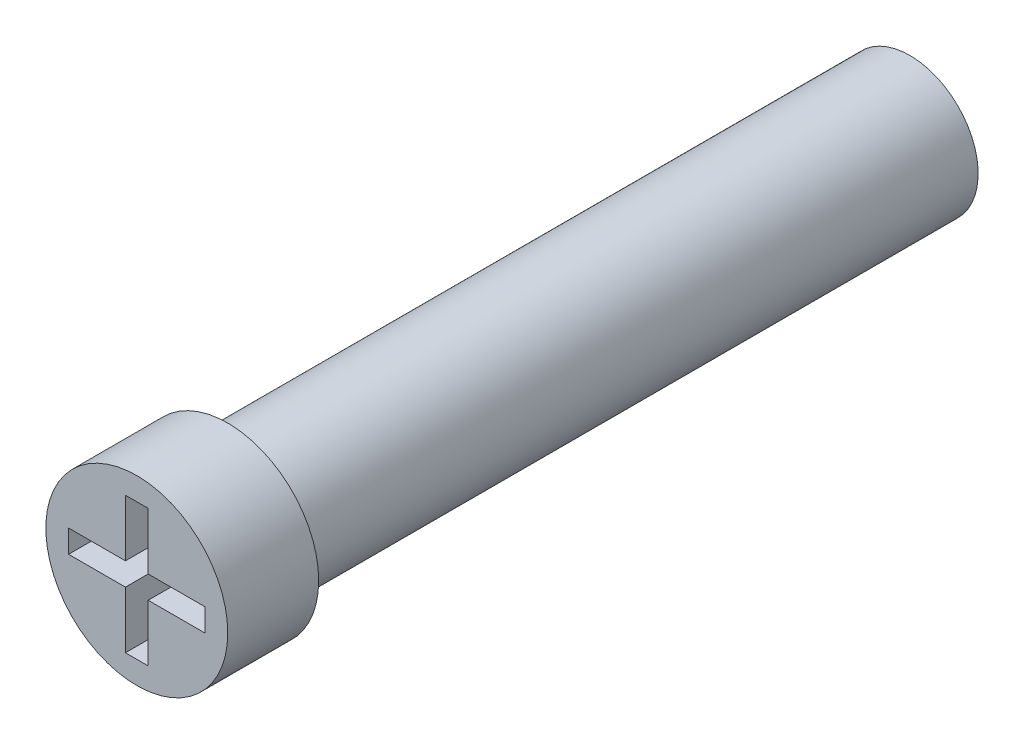
ISO-10303-21;
HEADER;
FILE_DESCRIPTION(('STEP AP214'),'2;1');
FILE_NAME('part.step','',(''),(''),'','','');
FILE_SCHEMA(('AUTOMOTIVE_DESIGN { 1 0 10303 214 1 1 1 1 }'));
ENDSEC;
DATA;
#1=APPLICATION_CONTEXT('core data for automotive mechanical design processes');
#2=APPLICATION_PROTOCOL_DEFINITION('international standard','automotive_design',2000,#1);
#3=PRODUCT_CONTEXT('',#1,'mechanical');
#4=PRODUCT('Part','Part','',(#3));
#5=PRODUCT_RELATED_PRODUCT_CATEGORY('part','',(#4));
#6=PRODUCT_DEFINITION_FORMATION('','',#4);
#7=PRODUCT_DEFINITION_CONTEXT('part definition',#1,'design');
#8=PRODUCT_DEFINITION('design','',#6,#7);
#9=PRODUCT_DEFINITION_SHAPE('','',#8);
#10=(LENGTH_UNIT() NAMED_UNIT(*) SI_UNIT(.MILLI.,.METRE.));
#11=(NAMED_UNIT(*) PLANE_ANGLE_UNIT() SI_UNIT($,.RADIAN.));
#12=(NAMED_UNIT(*) SI_UNIT($,.STERADIAN.) SOLID_ANGLE_UNIT());
#13=UNCERTAINTY_MEASURE_WITH_UNIT(LENGTH_MEASURE(1.E-05),#10,'distance_accuracy_value','');
#14=(GEOMETRIC_REPRESENTATION_CONTEXT(3) GLOBAL_UNCERTAINTY_ASSIGNED_CONTEXT((#13)) GLOBAL_UNIT_ASSIGNED_CONTEXT((#10,
#11,#12)) REPRESENTATION_CONTEXT('',''));
#15=CARTESIAN_POINT('',(0.,0.,0.));
#16=DIRECTION('',(0.,0.,1.));
#17=DIRECTION('',(1.,0.,0.));
#18=AXIS2_PLACEMENT_3D('',#15,#16,#17);
#19=CARTESIAN_POINT('',(0.,0.,2.));
#20=DIRECTION('',(0.,0.,1.));
#21=DIRECTION('',(1.,0.,0.));
#22=AXIS2_PLACEMENT_3D('',#19,#20,#21);
#23=PLANE('',#22);
#24=CARTESIAN_POINT('',(0.,0.,2.));
#25=DIRECTION('',(0.,0.,1.));
#26=DIRECTION('',(1.,0.,0.));
#27=AXIS2_PLACEMENT_3D('',#24,#25,#26);
#28=CIRCLE('',#27,2.);
#29=CARTESIAN_POINT('',(2.,0.,2.));
#30=VERTEX_POINT('',#29);
#31=EDGE_CURVE('E49',#30,#30,#28,.T.);
#32=ORIENTED_EDGE('',*,*,#31,.T.);
#33=EDGE_LOOP('',(#32));
#34=FACE_BOUND('',#33,.T.);
#35=DIRECTION('',(1.,0.,0.));
#36=VECTOR('',#35,1.);
#37=CARTESIAN_POINT('',(0.,1.5,2.));
#38=LINE('',#37,#36);
#39=CARTESIAN_POINT('',(-0.25,1.5,2.));
#40=VERTEX_POINT('',#39);
#41=CARTESIAN_POINT('',(0.25,1.5,2.));
#42=VERTEX_POINT('',#41);
#43=EDGE_CURVE('E176',#40,#42,#38,.T.);
#44=ORIENTED_EDGE('',*,*,#43,.T.);
#45=DIRECTION('',(0.,-1.,0.));
#46=VECTOR('',#45,1.);
#47=CARTESIAN_POINT('',(0.25,0.,2.));
#48=LINE('',#47,#46);
#49=CARTESIAN_POINT('',(0.25,0.25,2.));
#50=VERTEX_POINT('',#49);
#51=EDGE_CURVE('E57',#42,#50,#48,.T.);
#52=ORIENTED_EDGE('',*,*,#51,.T.);
#53=DIRECTION('',(1.,0.,0.));
#54=VECTOR('',#53,1.);
#55=CARTESIAN_POINT('',(0.,0.25,2.));
#56=LINE('',#55,#54);
#57=CARTESIAN_POINT('',(1.5,0.25,2.));
#58=VERTEX_POINT('',#57);
#59=EDGE_CURVE('E107',#50,#58,#56,.T.);
#60=ORIENTED_EDGE('',*,*,#59,.T.);
#61=DIRECTION('',(0.,-1.,0.));
#62=VECTOR('',#61,1.);
#63=CARTESIAN_POINT('',(1.5,0.,2.));
#64=LINE('',#63,#62);
#65=CARTESIAN_POINT('',(1.5,-0.25,2.));
#66=VERTEX_POINT('',#65);
#67=EDGE_CURVE('E210',#58,#66,#64,.T.);
#68=ORIENTED_EDGE('',*,*,#67,.T.);
#69=DIRECTION('',(1.,0.,0.));
#70=VECTOR('',#69,1.);
#71=CARTESIAN_POINT('',(0.,-0.25,2.));
#72=LINE('',#71,#70);
#73=CARTESIAN_POINT('',(0.25,-0.25,2.));
#74=VERTEX_POINT('',#73);
#75=EDGE_CURVE('E155',#74,#66,#72,.T.);
#76=ORIENTED_EDGE('',*,*,#75,.F.);
#77=DIRECTION('',(0.,-1.,0.));
#78=VECTOR('',#77,1.);
#79=CARTESIAN_POINT('',(0.25,0.,2.));
#80=LINE('',#79,#78);
#81=CARTESIAN_POINT('',(0.250000000000001,-1.5,2.));
#82=VERTEX_POINT('',#81);
#83=EDGE_CURVE('E204',#74,#82,#80,.T.);
#84=ORIENTED_EDGE('',*,*,#83,.T.);
#85=DIRECTION('',(1.,0.,0.));
#86=VECTOR('',#85,1.);
#87=CARTESIAN_POINT('',(0.,-1.5,2.));
#88=LINE('',#87,#86);
#89=CARTESIAN_POINT('',(-0.249999999999999,-1.5,2.));
#90=VERTEX_POINT('',#89);
#91=EDGE_CURVE('E200',#90,#82,#88,.T.);
#92=ORIENTED_EDGE('',*,*,#91,.F.);
#93=DIRECTION('',(0.,-1.,0.));
#94=VECTOR('',#93,1.);
#95=CARTESIAN_POINT('',(-0.25,0.,2.));
#96=LINE('',#95,#94);
#97=CARTESIAN_POINT('',(-0.25,-0.25,2.));
#98=VERTEX_POINT('',#97);
#99=EDGE_CURVE('E196',#98,#90,#96,.T.);
#100=ORIENTED_EDGE('',*,*,#99,.F.);
#101=DIRECTION('',(1.,0.,0.));
#102=VECTOR('',#101,1.);
#103=CARTESIAN_POINT('',(0.,-0.25,2.));
#104=LINE('',#103,#102);
#105=CARTESIAN_POINT('',(-1.5,-0.25,2.));
#106=VERTEX_POINT('',#105);
#107=EDGE_CURVE('E192',#106,#98,#104,.T.);
#108=ORIENTED_EDGE('',*,*,#107,.F.);
#109=DIRECTION('',(0.,-1.,0.));
#110=VECTOR('',#109,1.);
#111=CARTESIAN_POINT('',(-1.5,0.,2.));
#112=LINE('',#111,#110);
#113=CARTESIAN_POINT('',(-1.5,0.25,2.));
#114=VERTEX_POINT('',#113);
#115=EDGE_CURVE('E188',#114,#106,#112,.T.);
#116=ORIENTED_EDGE('',*,*,#115,.F.);
#117=DIRECTION('',(1.,0.,0.));
#118=VECTOR('',#117,1.);
#119=CARTESIAN_POINT('',(0.,0.25,2.));
#120=LINE('',#119,#118);
#121=CARTESIAN_POINT('',(-0.25,0.25,2.));
#122=VERTEX_POINT('',#121);
#123=EDGE_CURVE('E184',#114,#122,#120,.T.);
#124=ORIENTED_EDGE('',*,*,#123,.T.);
#125=DIRECTION('',(0.,-1.,0.));
#126=VECTOR('',#125,1.);
#127=CARTESIAN_POINT('',(-0.25,0.,2.));
#128=LINE('',#127,#126);
#129=EDGE_CURVE('E180',#40,#122,#128,.T.);
#130=ORIENTED_EDGE('',*,*,#129,.F.);
#131=EDGE_LOOP('',(#44,#52,#60,#68,#76,#84,#92,#100,#108,#116,#124,#130));
#132=FACE_BOUND('',#131,.T.);
#133=ADVANCED_FACE('F39',(#34,#132),#23,.T.);
#134=CARTESIAN_POINT('',(0.,0.,2.));
#135=DIRECTION('',(0.,0.,-1.));
#136=DIRECTION('',(-1.,0.,0.));
#137=AXIS2_PLACEMENT_3D('',#134,#135,#136);
#138=CYLINDRICAL_SURFACE('',#137,2.);
#139=ORIENTED_EDGE('',*,*,#31,.F.);
#140=EDGE_LOOP('',(#139));
#141=FACE_BOUND('',#140,.T.);
#142=CARTESIAN_POINT('',(0.,0.,0.));
#143=DIRECTION('',(0.,0.,1.));
#144=DIRECTION('',(1.,0.,0.));
#145=AXIS2_PLACEMENT_3D('',#142,#143,#144);
#146=CIRCLE('',#145,2.);
#147=CARTESIAN_POINT('',(2.,0.,0.));
#148=VERTEX_POINT('',#147);
#149=EDGE_CURVE('E43',#148,#148,#146,.T.);
#150=ORIENTED_EDGE('',*,*,#149,.T.);
#151=EDGE_LOOP('',(#150));
#152=FACE_BOUND('',#151,.T.);
#153=ADVANCED_FACE('F41',(#141,#152),#138,.T.);
#154=CARTESIAN_POINT('',(0.,0.,0.));
#155=DIRECTION('',(0.,0.,1.));
#156=DIRECTION('',(1.,0.,0.));
#157=AXIS2_PLACEMENT_3D('',#154,#155,#156);
#158=PLANE('',#157);
#159=CARTESIAN_POINT('',(0.,0.,0.));
#160=DIRECTION('',(0.,0.,-1.));
#161=DIRECTION('',(-1.,0.,0.));
#162=AXIS2_PLACEMENT_3D('',#159,#160,#161);
#163=CIRCLE('',#162,1.5);
#164=CARTESIAN_POINT('',(-1.5,0.,0.));
#165=VERTEX_POINT('',#164);
#166=EDGE_CURVE('E11',#165,#165,#163,.T.);
#167=ORIENTED_EDGE('',*,*,#166,.F.);
#168=EDGE_LOOP('',(#167));
#169=FACE_BOUND('',#168,.T.);
#170=ORIENTED_EDGE('',*,*,#149,.F.);
#171=EDGE_LOOP('',(#170));
#172=FACE_BOUND('',#171,.T.);
#173=ADVANCED_FACE('F258',(#169,#172),#158,.F.);
#174=CARTESIAN_POINT('',(0.,0.,-15.));
#175=DIRECTION('',(0.,0.,1.));
#176=DIRECTION('',(1.,0.,0.));
#177=AXIS2_PLACEMENT_3D('',#174,#175,#176);
#178=CYLINDRICAL_SURFACE('',#177,1.5);
#179=CARTESIAN_POINT('',(0.,0.,-15.));
#180=DIRECTION('',(0.,0.,-1.));
#181=DIRECTION('',(-1.,0.,0.));
#182=AXIS2_PLACEMENT_3D('',#179,#180,#181);
#183=CIRCLE('',#182,1.5);
#184=CARTESIAN_POINT('',(-1.5,0.,-15.));
#185=VERTEX_POINT('',#184);
#186=EDGE_CURVE('E219',#185,#185,#183,.T.);
#187=ORIENTED_EDGE('',*,*,#186,.F.);
#188=EDGE_LOOP('',(#187));
#189=FACE_BOUND('',#188,.T.);
#190=ORIENTED_EDGE('',*,*,#166,.T.);
#191=EDGE_LOOP('',(#190));
#192=FACE_BOUND('',#191,.T.);
#193=ADVANCED_FACE('F260',(#189,#192),#178,.T.);
#194=CARTESIAN_POINT('',(0.,0.,-15.));
#195=DIRECTION('',(0.,0.,-1.));
#196=DIRECTION('',(-1.,0.,0.));
#197=AXIS2_PLACEMENT_3D('',#194,#195,#196);
#198=PLANE('',#197);
#199=ORIENTED_EDGE('',*,*,#186,.T.);
#200=EDGE_LOOP('',(#199));
#201=FACE_BOUND('',#200,.T.);
#202=ADVANCED_FACE('F266',(#201),#198,.T.);
#203=CARTESIAN_POINT('',(0.25,0.,1.));
#204=DIRECTION('',(-1.,0.,0.));
#205=DIRECTION('',(0.,-1.,0.));
#206=AXIS2_PLACEMENT_3D('',#203,#204,#205);
#207=PLANE('',#206);
#208=ORIENTED_EDGE('',*,*,#51,.F.);
#209=DIRECTION('',(0.,0.,1.));
#210=VECTOR('',#209,1.);
#211=CARTESIAN_POINT('',(0.25,1.5,1.));
#212=LINE('',#211,#210);
#213=CARTESIAN_POINT('',(0.25,1.5,1.));
#214=VERTEX_POINT('',#213);
#215=EDGE_CURVE('E173',#214,#42,#212,.T.);
#216=ORIENTED_EDGE('',*,*,#215,.F.);
#217=DIRECTION('',(0.,-1.,0.));
#218=VECTOR('',#217,1.);
#219=CARTESIAN_POINT('',(0.25,0.,1.));
#220=LINE('',#219,#218);
#221=CARTESIAN_POINT('',(0.25,0.25,1.));
#222=VERTEX_POINT('',#221);
#223=EDGE_CURVE('E215',#214,#222,#220,.T.);
#224=ORIENTED_EDGE('',*,*,#223,.T.);
#225=DIRECTION('',(0.,0.,1.));
#226=VECTOR('',#225,1.);
#227=CARTESIAN_POINT('',(0.25,0.25,1.));
#228=LINE('',#227,#226);
#229=EDGE_CURVE('E216',#222,#50,#228,.T.);
#230=ORIENTED_EDGE('',*,*,#229,.T.);
#231=EDGE_LOOP('',(#208,#216,#224,#230));
#232=FACE_BOUND('',#231,.T.);
#233=ADVANCED_FACE('F279',(#232),#207,.T.);
#234=CARTESIAN_POINT('',(0.,0.25,1.));
#235=DIRECTION('',(0.,-1.,0.));
#236=DIRECTION('',(0.,0.,-1.));
#237=AXIS2_PLACEMENT_3D('',#234,#235,#236);
#238=PLANE('',#237);
#239=ORIENTED_EDGE('',*,*,#59,.F.);
#240=ORIENTED_EDGE('',*,*,#229,.F.);
#241=DIRECTION('',(1.,0.,0.));
#242=VECTOR('',#241,1.);
#243=CARTESIAN_POINT('',(0.,0.25,1.));
#244=LINE('',#243,#242);
#245=CARTESIAN_POINT('',(1.5,0.25,1.));
#246=VERTEX_POINT('',#245);
#247=EDGE_CURVE('E66',#222,#246,#244,.T.);
#248=ORIENTED_EDGE('',*,*,#247,.T.);
#249=DIRECTION('',(0.,0.,1.));
#250=VECTOR('',#249,1.);
#251=CARTESIAN_POINT('',(1.5,0.25,1.));
#252=LINE('',#251,#250);
#253=EDGE_CURVE('E146',#246,#58,#252,.T.);
#254=ORIENTED_EDGE('',*,*,#253,.T.);
#255=EDGE_LOOP('',(#239,#240,#248,#254));
#256=FACE_BOUND('',#255,.T.);
#257=ADVANCED_FACE('F283',(#256),#238,.T.);
#258=CARTESIAN_POINT('',(1.5,0.,1.));
#259=DIRECTION('',(-1.,0.,0.));
#260=DIRECTION('',(0.,0.,1.));
#261=AXIS2_PLACEMENT_3D('',#258,#259,#260);
#262=PLANE('',#261);
#263=ORIENTED_EDGE('',*,*,#67,.F.);
#264=ORIENTED_EDGE('',*,*,#253,.F.);
#265=DIRECTION('',(0.,-1.,0.));
#266=VECTOR('',#265,1.);
#267=CARTESIAN_POINT('',(1.5,0.,1.));
#268=LINE('',#267,#266);
#269=CARTESIAN_POINT('',(1.5,-0.25,1.));
#270=VERTEX_POINT('',#269);
#271=EDGE_CURVE('E140',#246,#270,#268,.T.);
#272=ORIENTED_EDGE('',*,*,#271,.T.);
#273=DIRECTION('',(0.,0.,1.));
#274=VECTOR('',#273,1.);
#275=CARTESIAN_POINT('',(1.5,-0.25,1.));
#276=LINE('',#275,#274);
#277=EDGE_CURVE('E144',#270,#66,#276,.T.);
#278=ORIENTED_EDGE('',*,*,#277,.T.);
#279=EDGE_LOOP('',(#263,#264,#272,#278));
#280=FACE_BOUND('',#279,.T.);
#281=ADVANCED_FACE('F143',(#280),#262,.T.);
#282=CARTESIAN_POINT('',(0.,-0.25,1.));
#283=DIRECTION('',(0.,-1.,0.));
#284=DIRECTION('',(1.,0.,0.));
#285=AXIS2_PLACEMENT_3D('',#282,#283,#284);
#286=PLANE('',#285);
#287=ORIENTED_EDGE('',*,*,#75,.T.);
#288=ORIENTED_EDGE('',*,*,#277,.F.);
#289=DIRECTION('',(1.,0.,0.));
#290=VECTOR('',#289,1.);
#291=CARTESIAN_POINT('',(0.,-0.25,1.));
#292=LINE('',#291,#290);
#293=CARTESIAN_POINT('',(0.25,-0.25,1.));
#294=VERTEX_POINT('',#293);
#295=EDGE_CURVE('E149',#294,#270,#292,.T.);
#296=ORIENTED_EDGE('',*,*,#295,.F.);
#297=DIRECTION('',(0.,0.,1.));
#298=VECTOR('',#297,1.);
#299=CARTESIAN_POINT('',(0.25,-0.25,1.));
#300=LINE('',#299,#298);
#301=EDGE_CURVE('E158',#294,#74,#300,.T.);
#302=ORIENTED_EDGE('',*,*,#301,.T.);
#303=EDGE_LOOP('',(#287,#288,#296,#302));
#304=FACE_BOUND('',#303,.T.);
#305=ADVANCED_FACE('F153',(#304),#286,.F.);
#306=CARTESIAN_POINT('',(0.25,0.,1.));
#307=DIRECTION('',(-1.,0.,0.));
#308=DIRECTION('',(0.,-1.,0.));
#309=AXIS2_PLACEMENT_3D('',#306,#307,#308);
#310=PLANE('',#309);
#311=ORIENTED_EDGE('',*,*,#83,.F.);
#312=ORIENTED_EDGE('',*,*,#301,.F.);
#313=DIRECTION('',(0.,-1.,0.));
#314=VECTOR('',#313,1.);
#315=CARTESIAN_POINT('',(0.25,0.,1.));
#316=LINE('',#315,#314);
#317=CARTESIAN_POINT('',(0.250000000000001,-1.5,1.));
#318=VERTEX_POINT('',#317);
#319=EDGE_CURVE('E163',#294,#318,#316,.T.);
#320=ORIENTED_EDGE('',*,*,#319,.T.);
#321=DIRECTION('',(0.,0.,1.));
#322=VECTOR('',#321,1.);
#323=CARTESIAN_POINT('',(0.250000000000001,-1.5,1.));
#324=LINE('',#323,#322);
#325=EDGE_CURVE('E224',#318,#82,#324,.T.);
#326=ORIENTED_EDGE('',*,*,#325,.T.);
#327=EDGE_LOOP('',(#311,#312,#320,#326));
#328=FACE_BOUND('',#327,.T.);
#329=ADVANCED_FACE('F310',(#328),#310,.T.);
#330=CARTESIAN_POINT('',(0.,-1.5,1.));
#331=DIRECTION('',(0.,-1.,0.));
#332=DIRECTION('',(0.,0.,-1.));
#333=AXIS2_PLACEMENT_3D('',#330,#331,#332);
#334=PLANE('',#333);
#335=ORIENTED_EDGE('',*,*,#91,.T.);
#336=ORIENTED_EDGE('',*,*,#325,.F.);
#337=DIRECTION('',(1.,0.,0.));
#338=VECTOR('',#337,1.);
#339=CARTESIAN_POINT('',(0.,-1.5,1.));
#340=LINE('',#339,#338);
#341=CARTESIAN_POINT('',(-0.249999999999999,-1.5,1.));
#342=VERTEX_POINT('',#341);
#343=EDGE_CURVE('E167',#342,#318,#340,.T.);
#344=ORIENTED_EDGE('',*,*,#343,.F.);
#345=DIRECTION('',(0.,0.,1.));
#346=VECTOR('',#345,1.);
#347=CARTESIAN_POINT('',(-0.249999999999999,-1.5,1.));
#348=LINE('',#347,#346);
#349=EDGE_CURVE('E227',#342,#90,#348,.T.);
#350=ORIENTED_EDGE('',*,*,#349,.T.);
#351=EDGE_LOOP('',(#335,#336,#344,#350));
#352=FACE_BOUND('',#351,.T.);
#353=ADVANCED_FACE('F306',(#352),#334,.F.);
#354=CARTESIAN_POINT('',(-0.25,0.,1.));
#355=DIRECTION('',(-1.,0.,0.));
#356=DIRECTION('',(0.,-1.,0.));
#357=AXIS2_PLACEMENT_3D('',#354,#355,#356);
#358=PLANE('',#357);
#359=ORIENTED_EDGE('',*,*,#99,.T.);
#360=ORIENTED_EDGE('',*,*,#349,.F.);
#361=DIRECTION('',(0.,-1.,0.));
#362=VECTOR('',#361,1.);
#363=CARTESIAN_POINT('',(-0.25,0.,1.));
#364=LINE('',#363,#362);
#365=CARTESIAN_POINT('',(-0.25,-0.25,1.));
#366=VERTEX_POINT('',#365);
#367=EDGE_CURVE('E461',#366,#342,#364,.T.);
#368=ORIENTED_EDGE('',*,*,#367,.F.);
#369=DIRECTION('',(0.,0.,1.));
#370=VECTOR('',#369,1.);
#371=CARTESIAN_POINT('',(-0.25,-0.25,1.));
#372=LINE('',#371,#370);
#373=EDGE_CURVE('E230',#366,#98,#372,.T.);
#374=ORIENTED_EDGE('',*,*,#373,.T.);
#375=EDGE_LOOP('',(#359,#360,#368,#374));
#376=FACE_BOUND('',#375,.T.);
#377=ADVANCED_FACE('F302',(#376),#358,.F.);
#378=CARTESIAN_POINT('',(0.,-0.25,1.));
#379=DIRECTION('',(0.,-1.,0.));
#380=DIRECTION('',(1.,0.,0.));
#381=AXIS2_PLACEMENT_3D('',#378,#379,#380);
#382=PLANE('',#381);
#383=ORIENTED_EDGE('',*,*,#107,.T.);
#384=ORIENTED_EDGE('',*,*,#373,.F.);
#385=DIRECTION('',(1.,0.,0.));
#386=VECTOR('',#385,1.);
#387=CARTESIAN_POINT('',(0.,-0.25,1.));
#388=LINE('',#387,#386);
#389=CARTESIAN_POINT('',(-1.5,-0.25,1.));
#390=VERTEX_POINT('',#389);
#391=EDGE_CURVE('E457',#390,#366,#388,.T.);
#392=ORIENTED_EDGE('',*,*,#391,.F.);
#393=DIRECTION('',(0.,0.,1.));
#394=VECTOR('',#393,1.);
#395=CARTESIAN_POINT('',(-1.5,-0.25,1.));
#396=LINE('',#395,#394);
#397=EDGE_CURVE('E233',#390,#106,#396,.T.);
#398=ORIENTED_EDGE('',*,*,#397,.T.);
#399=EDGE_LOOP('',(#383,#384,#392,#398));
#400=FACE_BOUND('',#399,.T.);
#401=ADVANCED_FACE('F298',(#400),#382,.F.);
#402=CARTESIAN_POINT('',(-1.5,0.,1.));
#403=DIRECTION('',(-1.,0.,0.));
#404=DIRECTION('',(0.,0.,1.));
#405=AXIS2_PLACEMENT_3D('',#402,#403,#404);
#406=PLANE('',#405);
#407=ORIENTED_EDGE('',*,*,#115,.T.);
#408=ORIENTED_EDGE('',*,*,#397,.F.);
#409=DIRECTION('',(0.,-1.,0.));
#410=VECTOR('',#409,1.);
#411=CARTESIAN_POINT('',(-1.5,0.,1.));
#412=LINE('',#411,#410);
#413=CARTESIAN_POINT('',(-1.5,0.25,1.));
#414=VERTEX_POINT('',#413);
#415=EDGE_CURVE('E453',#414,#390,#412,.T.);
#416=ORIENTED_EDGE('',*,*,#415,.F.);
#417=DIRECTION('',(0.,0.,1.));
#418=VECTOR('',#417,1.);
#419=CARTESIAN_POINT('',(-1.5,0.25,1.));
#420=LINE('',#419,#418);
#421=EDGE_CURVE('E236',#414,#114,#420,.T.);
#422=ORIENTED_EDGE('',*,*,#421,.T.);
#423=EDGE_LOOP('',(#407,#408,#416,#422));
#424=FACE_BOUND('',#423,.T.);
#425=ADVANCED_FACE('F294',(#424),#406,.F.);
#426=CARTESIAN_POINT('',(0.,0.25,1.));
#427=DIRECTION('',(0.,-1.,0.));
#428=DIRECTION('',(0.,0.,-1.));
#429=AXIS2_PLACEMENT_3D('',#426,#427,#428);
#430=PLANE('',#429);
#431=ORIENTED_EDGE('',*,*,#123,.F.);
#432=ORIENTED_EDGE('',*,*,#421,.F.);
#433=DIRECTION('',(1.,0.,0.));
#434=VECTOR('',#433,1.);
#435=CARTESIAN_POINT('',(0.,0.25,1.));
#436=LINE('',#435,#434);
#437=CARTESIAN_POINT('',(-0.25,0.25,1.));
#438=VERTEX_POINT('',#437);
#439=EDGE_CURVE('E450',#414,#438,#436,.T.);
#440=ORIENTED_EDGE('',*,*,#439,.T.);
#441=DIRECTION('',(0.,0.,1.));
#442=VECTOR('',#441,1.);
#443=CARTESIAN_POINT('',(-0.25,0.25,1.));
#444=LINE('',#443,#442);
#445=EDGE_CURVE('E239',#438,#122,#444,.T.);
#446=ORIENTED_EDGE('',*,*,#445,.T.);
#447=EDGE_LOOP('',(#431,#432,#440,#446));
#448=FACE_BOUND('',#447,.T.);
#449=ADVANCED_FACE('F290',(#448),#430,.T.);
#450=CARTESIAN_POINT('',(-0.25,0.,1.));
#451=DIRECTION('',(-1.,0.,0.));
#452=DIRECTION('',(0.,-1.,0.));
#453=AXIS2_PLACEMENT_3D('',#450,#451,#452);
#454=PLANE('',#453);
#455=ORIENTED_EDGE('',*,*,#129,.T.);
#456=ORIENTED_EDGE('',*,*,#445,.F.);
#457=DIRECTION('',(0.,-1.,0.));
#458=VECTOR('',#457,1.);
#459=CARTESIAN_POINT('',(-0.25,0.,1.));
#460=LINE('',#459,#458);
#461=CARTESIAN_POINT('',(-0.25,1.5,1.));
#462=VERTEX_POINT('',#461);
#463=EDGE_CURVE('E445',#462,#438,#460,.T.);
#464=ORIENTED_EDGE('',*,*,#463,.F.);
#465=DIRECTION('',(0.,0.,1.));
#466=VECTOR('',#465,1.);
#467=CARTESIAN_POINT('',(-0.25,1.5,1.));
#468=LINE('',#467,#466);
#469=EDGE_CURVE('E242',#462,#40,#468,.T.);
#470=ORIENTED_EDGE('',*,*,#469,.T.);
#471=EDGE_LOOP('',(#455,#456,#464,#470));
#472=FACE_BOUND('',#471,.T.);
#473=ADVANCED_FACE('F287',(#472),#454,.F.);
#474=CARTESIAN_POINT('',(0.,1.5,1.));
#475=DIRECTION('',(0.,-1.,0.));
#476=DIRECTION('',(0.,0.,-1.));
#477=AXIS2_PLACEMENT_3D('',#474,#475,#476);
#478=PLANE('',#477);
#479=ORIENTED_EDGE('',*,*,#43,.F.);
#480=ORIENTED_EDGE('',*,*,#469,.F.);
#481=DIRECTION('',(1.,0.,0.));
#482=VECTOR('',#481,1.);
#483=CARTESIAN_POINT('',(0.,1.5,1.));
#484=LINE('',#483,#482);
#485=EDGE_CURVE('E114',#462,#214,#484,.T.);
#486=ORIENTED_EDGE('',*,*,#485,.T.);
#487=ORIENTED_EDGE('',*,*,#215,.T.);
#488=EDGE_LOOP('',(#479,#480,#486,#487));
#489=FACE_BOUND('',#488,.T.);
#490=ADVANCED_FACE('F284',(#489),#478,.T.);
#491=CARTESIAN_POINT('',(0.,0.,1.));
#492=DIRECTION('',(0.,0.,1.));
#493=DIRECTION('',(1.,0.,0.));
#494=AXIS2_PLACEMENT_3D('',#491,#492,#493);
#495=PLANE('',#494);
#496=ORIENTED_EDGE('',*,*,#223,.F.);
#497=ORIENTED_EDGE('',*,*,#485,.F.);
#498=ORIENTED_EDGE('',*,*,#463,.T.);
#499=ORIENTED_EDGE('',*,*,#439,.F.);
#500=ORIENTED_EDGE('',*,*,#415,.T.);
#501=ORIENTED_EDGE('',*,*,#391,.T.);
#502=ORIENTED_EDGE('',*,*,#367,.T.);
#503=ORIENTED_EDGE('',*,*,#343,.T.);
#504=ORIENTED_EDGE('',*,*,#319,.F.);
#505=ORIENTED_EDGE('',*,*,#295,.T.);
#506=ORIENTED_EDGE('',*,*,#271,.F.);
#507=ORIENTED_EDGE('',*,*,#247,.F.);
#508=EDGE_LOOP('',(#496,#497,#498,#499,#500,#501,#502,#503,#504,#505,#506,#507));
#509=FACE_BOUND('',#508,.T.);
#510=ADVANCED_FACE('F161',(#509),#495,.T.);
#511=CLOSED_SHELL('',(#133,#153,#173,#193,#202,#233,#257,#281,#305,#329,#353,#377,#401,#425,
#449,#473,#490,#510));
#512=MANIFOLD_SOLID_BREP('B2',#511);
#513=ADVANCED_BREP_SHAPE_REPRESENTATION('',(#18,#512),#14);
#514=SHAPE_DEFINITION_REPRESENTATION(#9,#513);
ENDSEC;
END-ISO-10303-21;
